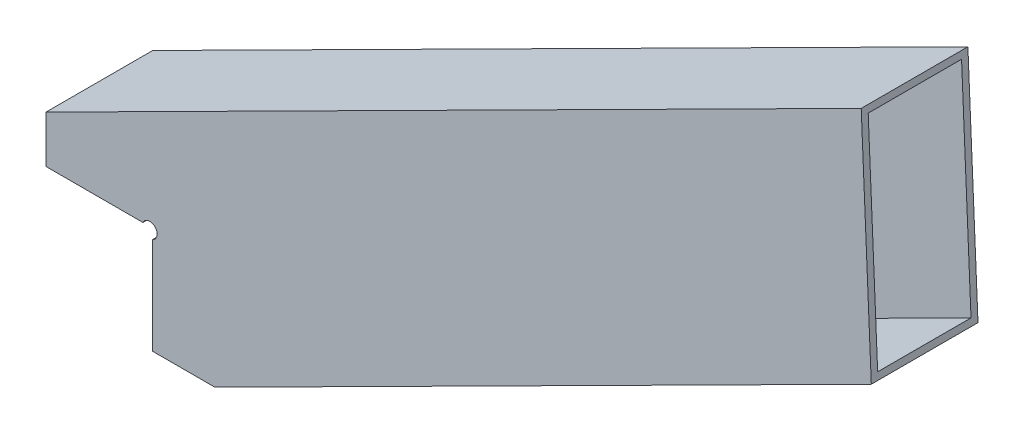
ISO-10303-21;
HEADER;
FILE_DESCRIPTION(('STEP AP214'),'2;1');
FILE_NAME('part.step','',(''),(''),'','','');
FILE_SCHEMA(('AUTOMOTIVE_DESIGN { 1 0 10303 214 1 1 1 1 }'));
ENDSEC;
DATA;
#1=APPLICATION_CONTEXT('core data for automotive mechanical design processes');
#2=APPLICATION_PROTOCOL_DEFINITION('international standard','automotive_design',2000,#1);
#3=PRODUCT_CONTEXT('',#1,'mechanical');
#4=PRODUCT('Part','Part','',(#3));
#5=PRODUCT_RELATED_PRODUCT_CATEGORY('part','',(#4));
#6=PRODUCT_DEFINITION_FORMATION('','',#4);
#7=PRODUCT_DEFINITION_CONTEXT('part definition',#1,'design');
#8=PRODUCT_DEFINITION('design','',#6,#7);
#9=PRODUCT_DEFINITION_SHAPE('','',#8);
#10=(LENGTH_UNIT() NAMED_UNIT(*) SI_UNIT(.MILLI.,.METRE.));
#11=(NAMED_UNIT(*) PLANE_ANGLE_UNIT() SI_UNIT($,.RADIAN.));
#12=(NAMED_UNIT(*) SI_UNIT($,.STERADIAN.) SOLID_ANGLE_UNIT());
#13=UNCERTAINTY_MEASURE_WITH_UNIT(LENGTH_MEASURE(1.E-05),#10,'distance_accuracy_value','');
#14=(GEOMETRIC_REPRESENTATION_CONTEXT(3) GLOBAL_UNCERTAINTY_ASSIGNED_CONTEXT((#13)) GLOBAL_UNIT_ASSIGNED_CONTEXT((#10,
#11,#12)) REPRESENTATION_CONTEXT('',''));
#15=CARTESIAN_POINT('',(0.,0.,0.));
#16=DIRECTION('',(0.,0.,1.));
#17=DIRECTION('',(1.,0.,0.));
#18=AXIS2_PLACEMENT_3D('',#15,#16,#17);
#19=CARTESIAN_POINT('',(171.838432799996,137.597905652,25.4));
#20=DIRECTION('',(-0.999070171367097,-0.0431137180549207,0.));
#21=DIRECTION('',(0.0431137180549207,-0.999070171367097,0.));
#22=AXIS2_PLACEMENT_3D('',#19,#20,#21);
#23=PLANE('',#22);
#24=DIRECTION('',(-0.0431137180549207,0.999070171367097,0.));
#25=VECTOR('',#24,1.);
#26=CARTESIAN_POINT('',(171.838432799996,137.597905652,0.));
#27=LINE('',#26,#25);
#28=CARTESIAN_POINT('',(174.241035507582,81.9226169715513,0.));
#29=VERTEX_POINT('',#28);
#30=CARTESIAN_POINT('',(171.838432799996,137.597905652,0.));
#31=VERTEX_POINT('',#30);
#32=EDGE_CURVE('E211',#29,#31,#27,.T.);
#33=ORIENTED_EDGE('',*,*,#32,.T.);
#34=DIRECTION('',(0.,0.,-1.));
#35=VECTOR('',#34,1.);
#36=CARTESIAN_POINT('',(171.838432799996,137.597905652,25.4));
#37=LINE('',#36,#35);
#38=CARTESIAN_POINT('',(171.838432799996,137.597905652,25.4));
#39=VERTEX_POINT('',#38);
#40=EDGE_CURVE('E46',#39,#31,#37,.T.);
#41=ORIENTED_EDGE('',*,*,#40,.F.);
#42=DIRECTION('',(-0.0431137180549207,0.999070171367097,0.));
#43=VECTOR('',#42,1.);
#44=CARTESIAN_POINT('',(171.838432799996,137.597905652,25.4));
#45=LINE('',#44,#43);
#46=CARTESIAN_POINT('',(174.241035507582,81.9226169715513,25.4));
#47=VERTEX_POINT('',#46);
#48=EDGE_CURVE('E183',#47,#39,#45,.T.);
#49=ORIENTED_EDGE('',*,*,#48,.F.);
#50=DIRECTION('',(0.,0.,-1.));
#51=VECTOR('',#50,1.);
#52=CARTESIAN_POINT('',(174.241035507582,81.9226169715513,25.4));
#53=LINE('',#52,#51);
#54=EDGE_CURVE('E184',#47,#29,#53,.T.);
#55=ORIENTED_EDGE('',*,*,#54,.T.);
#56=EDGE_LOOP('',(#33,#41,#49,#55));
#57=FACE_BOUND('',#56,.T.);
#58=DIRECTION('',(-0.0431137180549207,0.999070171367097,0.));
#59=VECTOR('',#58,1.);
#60=CARTESIAN_POINT('',(171.838432799996,137.597905652,1.5875));
#61=LINE('',#60,#59);
#62=CARTESIAN_POINT('',(174.16595417297,83.6624697428153,1.5875));
#63=VERTEX_POINT('',#62);
#64=CARTESIAN_POINT('',(171.913514134608,135.858052880736,1.5875));
#65=VERTEX_POINT('',#64);
#66=EDGE_CURVE('E233',#63,#65,#61,.T.);
#67=ORIENTED_EDGE('',*,*,#66,.F.);
#68=DIRECTION('',(0.,0.,-1.));
#69=VECTOR('',#68,1.);
#70=CARTESIAN_POINT('',(174.16595417297,83.6624697428153,25.4));
#71=LINE('',#70,#69);
#72=CARTESIAN_POINT('',(174.16595417297,83.6624697428153,23.8125));
#73=VERTEX_POINT('',#72);
#74=EDGE_CURVE('E237',#73,#63,#71,.T.);
#75=ORIENTED_EDGE('',*,*,#74,.F.);
#76=DIRECTION('',(-0.0431137180549207,0.999070171367097,0.));
#77=VECTOR('',#76,1.);
#78=CARTESIAN_POINT('',(171.838432799996,137.597905652,23.8125));
#79=LINE('',#78,#77);
#80=CARTESIAN_POINT('',(171.913514134608,135.858052880736,23.8125));
#81=VERTEX_POINT('',#80);
#82=EDGE_CURVE('E242',#73,#81,#79,.T.);
#83=ORIENTED_EDGE('',*,*,#82,.T.);
#84=DIRECTION('',(0.,0.,-1.));
#85=VECTOR('',#84,1.);
#86=CARTESIAN_POINT('',(171.913514134608,135.858052880736,25.4));
#87=LINE('',#86,#85);
#88=EDGE_CURVE('E215',#81,#65,#87,.T.);
#89=ORIENTED_EDGE('',*,*,#88,.T.);
#90=EDGE_LOOP('',(#67,#75,#83,#89));
#91=FACE_BOUND('',#90,.T.);
#92=ADVANCED_FACE('F39',(#57,#91),#23,.F.);
#93=CARTESIAN_POINT('',(-22.225,39.8002772283526,25.4));
#94=DIRECTION('',(1.,0.,0.));
#95=DIRECTION('',(0.,1.,0.));
#96=AXIS2_PLACEMENT_3D('',#93,#94,#95);
#97=PLANE('',#96);
#98=DIRECTION('',(0.,-1.,0.));
#99=VECTOR('',#98,1.);
#100=CARTESIAN_POINT('',(-22.225,39.8002772283526,1.5875));
#101=LINE('',#100,#99);
#102=CARTESIAN_POINT('',(-22.225,38.0225874655544,1.5875));
#103=VERTEX_POINT('',#102);
#104=CARTESIAN_POINT('',(-22.225,28.575,1.5875));
#105=VERTEX_POINT('',#104);
#106=EDGE_CURVE('E266',#103,#105,#101,.T.);
#107=ORIENTED_EDGE('',*,*,#106,.F.);
#108=DIRECTION('',(0.,0.,-1.));
#109=VECTOR('',#108,1.);
#110=CARTESIAN_POINT('',(-22.225,38.0225874655544,25.4));
#111=LINE('',#110,#109);
#112=CARTESIAN_POINT('',(-22.225,38.0225874655544,23.8125));
#113=VERTEX_POINT('',#112);
#114=EDGE_CURVE('E218',#113,#103,#111,.T.);
#115=ORIENTED_EDGE('',*,*,#114,.F.);
#116=DIRECTION('',(0.,-1.,0.));
#117=VECTOR('',#116,1.);
#118=CARTESIAN_POINT('',(-22.225,39.8002772283526,23.8125));
#119=LINE('',#118,#117);
#120=CARTESIAN_POINT('',(-22.225,28.575,23.8125));
#121=VERTEX_POINT('',#120);
#122=EDGE_CURVE('E247',#113,#121,#119,.T.);
#123=ORIENTED_EDGE('',*,*,#122,.T.);
#124=DIRECTION('',(0.,0.,-1.));
#125=VECTOR('',#124,1.);
#126=CARTESIAN_POINT('',(-22.225,28.575,25.4));
#127=LINE('',#126,#125);
#128=CARTESIAN_POINT('',(-22.225,28.575,25.4));
#129=VERTEX_POINT('',#128);
#130=EDGE_CURVE('E195',#129,#121,#127,.T.);
#131=ORIENTED_EDGE('',*,*,#130,.F.);
#132=DIRECTION('',(0.,-1.,0.));
#133=VECTOR('',#132,1.);
#134=CARTESIAN_POINT('',(-22.225,39.8002772283526,25.4));
#135=LINE('',#134,#133);
#136=CARTESIAN_POINT('',(-22.225,39.8002772283526,25.4));
#137=VERTEX_POINT('',#136);
#138=EDGE_CURVE('E229',#137,#129,#135,.T.);
#139=ORIENTED_EDGE('',*,*,#138,.F.);
#140=DIRECTION('',(0.,0.,-1.));
#141=VECTOR('',#140,1.);
#142=CARTESIAN_POINT('',(-22.225,39.8002772283526,25.4));
#143=LINE('',#142,#141);
#144=CARTESIAN_POINT('',(-22.225,39.8002772283526,0.));
#145=VERTEX_POINT('',#144);
#146=EDGE_CURVE('E198',#137,#145,#143,.T.);
#147=ORIENTED_EDGE('',*,*,#146,.T.);
#148=DIRECTION('',(0.,-1.,0.));
#149=VECTOR('',#148,1.);
#150=CARTESIAN_POINT('',(-22.225,39.8002772283526,0.));
#151=LINE('',#150,#149);
#152=CARTESIAN_POINT('',(-22.225,28.575,0.));
#153=VERTEX_POINT('',#152);
#154=EDGE_CURVE('E172',#145,#153,#151,.T.);
#155=ORIENTED_EDGE('',*,*,#154,.T.);
#156=EDGE_CURVE('E170',#105,#153,#127,.T.);
#157=ORIENTED_EDGE('',*,*,#156,.F.);
#158=EDGE_LOOP('',(#107,#115,#123,#131,#139,#147,#155,#157));
#159=FACE_BOUND('',#158,.T.);
#160=ADVANCED_FACE('F293',(#159),#97,.F.);
#161=CARTESIAN_POINT('',(-22.225,28.575,25.4));
#162=DIRECTION('',(0.,1.,0.));
#163=DIRECTION('',(-1.,0.,0.));
#164=AXIS2_PLACEMENT_3D('',#161,#162,#163);
#165=PLANE('',#164);
#166=DIRECTION('',(1.,0.,0.));
#167=VECTOR('',#166,1.);
#168=CARTESIAN_POINT('',(-22.225,28.575,0.));
#169=LINE('',#168,#167);
#170=CARTESIAN_POINT('',(0.84013340852202,28.575,0.));
#171=VERTEX_POINT('',#170);
#172=EDGE_CURVE('E163',#153,#171,#169,.T.);
#173=ORIENTED_EDGE('',*,*,#172,.T.);
#174=DIRECTION('',(0.,0.,1.));
#175=VECTOR('',#174,1.);
#176=CARTESIAN_POINT('',(0.84013340852202,28.575,0.));
#177=LINE('',#176,#175);
#178=CARTESIAN_POINT('',(0.84013340852202,28.575,1.5875));
#179=VERTEX_POINT('',#178);
#180=EDGE_CURVE('E148',#171,#179,#177,.T.);
#181=ORIENTED_EDGE('',*,*,#180,.T.);
#182=DIRECTION('',(1.,0.,0.));
#183=VECTOR('',#182,1.);
#184=CARTESIAN_POINT('',(-22.225,28.575,1.5875));
#185=LINE('',#184,#183);
#186=EDGE_CURVE('E264',#105,#179,#185,.T.);
#187=ORIENTED_EDGE('',*,*,#186,.F.);
#188=ORIENTED_EDGE('',*,*,#156,.T.);
#189=EDGE_LOOP('',(#173,#181,#187,#188));
#190=FACE_BOUND('',#189,.T.);
#191=ADVANCED_FACE('F168',(#190),#165,.F.);
#192=CARTESIAN_POINT('',(3.175,3.17499999999999,25.4));
#193=DIRECTION('',(1.,0.,0.));
#194=DIRECTION('',(0.,0.,-1.));
#195=AXIS2_PLACEMENT_3D('',#192,#193,#194);
#196=PLANE('',#195);
#197=DIRECTION('',(0.,-1.,0.));
#198=VECTOR('',#197,1.);
#199=CARTESIAN_POINT('',(3.175,3.17499999999999,1.5875));
#200=LINE('',#199,#198);
#201=CARTESIAN_POINT('',(3.175,26.240133408522,1.5875));
#202=VERTEX_POINT('',#201);
#203=CARTESIAN_POINT('',(3.175,3.17499999999999,1.5875));
#204=VERTEX_POINT('',#203);
#205=EDGE_CURVE('E262',#202,#204,#200,.T.);
#206=ORIENTED_EDGE('',*,*,#205,.F.);
#207=DIRECTION('',(0.,0.,1.));
#208=VECTOR('',#207,1.);
#209=CARTESIAN_POINT('',(3.175,26.240133408522,0.));
#210=LINE('',#209,#208);
#211=CARTESIAN_POINT('',(3.175,26.240133408522,0.));
#212=VERTEX_POINT('',#211);
#213=EDGE_CURVE('E60',#202,#212,#210,.F.);
#214=ORIENTED_EDGE('',*,*,#213,.T.);
#215=DIRECTION('',(0.,-1.,0.));
#216=VECTOR('',#215,1.);
#217=CARTESIAN_POINT('',(3.175,3.17499999999999,0.));
#218=LINE('',#217,#216);
#219=CARTESIAN_POINT('',(3.175,3.17499999999999,0.));
#220=VERTEX_POINT('',#219);
#221=EDGE_CURVE('E165',#212,#220,#218,.T.);
#222=ORIENTED_EDGE('',*,*,#221,.T.);
#223=DIRECTION('',(0.,0.,-1.));
#224=VECTOR('',#223,1.);
#225=CARTESIAN_POINT('',(3.175,3.17499999999999,25.4));
#226=LINE('',#225,#224);
#227=EDGE_CURVE('E191',#204,#220,#226,.T.);
#228=ORIENTED_EDGE('',*,*,#227,.F.);
#229=EDGE_LOOP('',(#206,#214,#222,#228));
#230=FACE_BOUND('',#229,.T.);
#231=ADVANCED_FACE('F321',(#230),#196,.F.);
#232=CARTESIAN_POINT('',(3.175,3.17499999999999,25.4));
#233=DIRECTION('',(0.,1.,0.));
#234=DIRECTION('',(-1.,0.,0.));
#235=AXIS2_PLACEMENT_3D('',#232,#233,#234);
#236=PLANE('',#235);
#237=DIRECTION('',(1.,0.,0.));
#238=VECTOR('',#237,1.);
#239=CARTESIAN_POINT('',(3.175,3.17499999999999,1.5875));
#240=LINE('',#239,#238);
#241=CARTESIAN_POINT('',(14.451706215811,3.175,1.5875));
#242=VERTEX_POINT('',#241);
#243=EDGE_CURVE('E260',#204,#242,#240,.T.);
#244=ORIENTED_EDGE('',*,*,#243,.F.);
#245=ORIENTED_EDGE('',*,*,#227,.T.);
#246=DIRECTION('',(1.,0.,0.));
#247=VECTOR('',#246,1.);
#248=CARTESIAN_POINT('',(3.175,3.17499999999999,0.));
#249=LINE('',#248,#247);
#250=CARTESIAN_POINT('',(17.9792414268653,3.175,0.));
#251=VERTEX_POINT('',#250);
#252=EDGE_CURVE('E174',#220,#251,#249,.T.);
#253=ORIENTED_EDGE('',*,*,#252,.T.);
#254=DIRECTION('',(0.,0.,-1.));
#255=VECTOR('',#254,1.);
#256=CARTESIAN_POINT('',(17.9792414268653,3.175,25.4));
#257=LINE('',#256,#255);
#258=CARTESIAN_POINT('',(17.9792414268653,3.175,25.4));
#259=VERTEX_POINT('',#258);
#260=EDGE_CURVE('E187',#259,#251,#257,.T.);
#261=ORIENTED_EDGE('',*,*,#260,.F.);
#262=DIRECTION('',(1.,0.,0.));
#263=VECTOR('',#262,1.);
#264=CARTESIAN_POINT('',(3.175,3.17499999999999,25.4));
#265=LINE('',#264,#263);
#266=CARTESIAN_POINT('',(3.175,3.17499999999999,25.4));
#267=VERTEX_POINT('',#266);
#268=EDGE_CURVE('E222',#267,#259,#265,.T.);
#269=ORIENTED_EDGE('',*,*,#268,.F.);
#270=CARTESIAN_POINT('',(3.175,3.17499999999999,23.8125));
#271=VERTEX_POINT('',#270);
#272=EDGE_CURVE('E192',#267,#271,#226,.T.);
#273=ORIENTED_EDGE('',*,*,#272,.T.);
#274=DIRECTION('',(1.,0.,0.));
#275=VECTOR('',#274,1.);
#276=CARTESIAN_POINT('',(3.175,3.17499999999999,23.8125));
#277=LINE('',#276,#275);
#278=CARTESIAN_POINT('',(14.451706215811,3.175,23.8125));
#279=VERTEX_POINT('',#278);
#280=EDGE_CURVE('E255',#271,#279,#277,.T.);
#281=ORIENTED_EDGE('',*,*,#280,.T.);
#282=DIRECTION('',(0.,0.,-1.));
#283=VECTOR('',#282,1.);
#284=CARTESIAN_POINT('',(14.451706215811,3.175,25.4));
#285=LINE('',#284,#283);
#286=EDGE_CURVE('E240',#279,#242,#285,.T.);
#287=ORIENTED_EDGE('',*,*,#286,.T.);
#288=EDGE_LOOP('',(#244,#245,#253,#261,#269,#273,#281,#287));
#289=FACE_BOUND('',#288,.T.);
#290=ADVANCED_FACE('F309',(#289),#236,.F.);
#291=CARTESIAN_POINT('',(171.838432799996,137.597905652,25.4));
#292=DIRECTION('',(0.450030943709705,-0.893012961666152,0.));
#293=DIRECTION('',(0.893012961666152,0.450030943709705,0.));
#294=AXIS2_PLACEMENT_3D('',#291,#292,#293);
#295=PLANE('',#294);
#296=DIRECTION('',(-0.893012961666152,-0.450030943709705,0.));
#297=VECTOR('',#296,1.);
#298=CARTESIAN_POINT('',(171.838432799996,137.597905652,0.));
#299=LINE('',#298,#297);
#300=EDGE_CURVE('E176',#31,#145,#299,.T.);
#301=ORIENTED_EDGE('',*,*,#300,.T.);
#302=ORIENTED_EDGE('',*,*,#146,.F.);
#303=DIRECTION('',(-0.893012961666152,-0.450030943709705,0.));
#304=VECTOR('',#303,1.);
#305=CARTESIAN_POINT('',(171.838432799996,137.597905652,25.4));
#306=LINE('',#305,#304);
#307=EDGE_CURVE('E206',#39,#137,#306,.T.);
#308=ORIENTED_EDGE('',*,*,#307,.F.);
#309=ORIENTED_EDGE('',*,*,#40,.T.);
#310=EDGE_LOOP('',(#301,#302,#308,#309));
#311=FACE_BOUND('',#310,.T.);
#312=ADVANCED_FACE('F204',(#311),#295,.F.);
#313=DIRECTION('',(1.,0.,0.));
#314=VECTOR('',#313,1.);
#315=CARTESIAN_POINT('',(-22.225,28.575,23.8125));
#316=LINE('',#315,#314);
#317=CARTESIAN_POINT('',(0.84013340852202,28.575,23.8125));
#318=VERTEX_POINT('',#317);
#319=EDGE_CURVE('E250',#121,#318,#316,.T.);
#320=ORIENTED_EDGE('',*,*,#319,.T.);
#321=DIRECTION('',(0.,0.,1.));
#322=VECTOR('',#321,1.);
#323=CARTESIAN_POINT('',(0.84013340852202,28.575,0.));
#324=LINE('',#323,#322);
#325=CARTESIAN_POINT('',(0.84013340852202,28.575,25.4));
#326=VERTEX_POINT('',#325);
#327=EDGE_CURVE('E53',#318,#326,#324,.T.);
#328=ORIENTED_EDGE('',*,*,#327,.T.);
#329=DIRECTION('',(1.,0.,0.));
#330=VECTOR('',#329,1.);
#331=CARTESIAN_POINT('',(-22.225,28.575,25.4));
#332=LINE('',#331,#330);
#333=EDGE_CURVE('E226',#129,#326,#332,.T.);
#334=ORIENTED_EDGE('',*,*,#333,.F.);
#335=ORIENTED_EDGE('',*,*,#130,.T.);
#336=EDGE_LOOP('',(#320,#328,#334,#335));
#337=FACE_BOUND('',#336,.T.);
#338=ADVANCED_FACE('F287',(#337),#165,.F.);
#339=DIRECTION('',(0.,-1.,0.));
#340=VECTOR('',#339,1.);
#341=CARTESIAN_POINT('',(3.175,3.17499999999999,25.4));
#342=LINE('',#341,#340);
#343=CARTESIAN_POINT('',(3.175,26.240133408522,25.4));
#344=VERTEX_POINT('',#343);
#345=EDGE_CURVE('E224',#344,#267,#342,.T.);
#346=ORIENTED_EDGE('',*,*,#345,.F.);
#347=DIRECTION('',(0.,0.,1.));
#348=VECTOR('',#347,1.);
#349=CARTESIAN_POINT('',(3.175,26.240133408522,0.));
#350=LINE('',#349,#348);
#351=CARTESIAN_POINT('',(3.175,26.240133408522,23.8125));
#352=VERTEX_POINT('',#351);
#353=EDGE_CURVE('E276',#344,#352,#350,.F.);
#354=ORIENTED_EDGE('',*,*,#353,.T.);
#355=DIRECTION('',(0.,-1.,0.));
#356=VECTOR('',#355,1.);
#357=CARTESIAN_POINT('',(3.175,3.17499999999999,23.8125));
#358=LINE('',#357,#356);
#359=EDGE_CURVE('E253',#352,#271,#358,.T.);
#360=ORIENTED_EDGE('',*,*,#359,.T.);
#361=ORIENTED_EDGE('',*,*,#272,.F.);
#362=EDGE_LOOP('',(#346,#354,#360,#361));
#363=FACE_BOUND('',#362,.T.);
#364=ADVANCED_FACE('F302',(#363),#196,.F.);
#365=CARTESIAN_POINT('',(174.241035507582,81.9226169715513,25.4));
#366=DIRECTION('',(-0.450030943709705,0.893012961666152,0.));
#367=DIRECTION('',(-0.893012961666152,-0.450030943709705,0.));
#368=AXIS2_PLACEMENT_3D('',#365,#366,#367);
#369=PLANE('',#368);
#370=DIRECTION('',(0.893012961666152,0.450030943709705,0.));
#371=VECTOR('',#370,1.);
#372=CARTESIAN_POINT('',(174.241035507582,81.9226169715513,0.));
#373=LINE('',#372,#371);
#374=EDGE_CURVE('E181',#251,#29,#373,.T.);
#375=ORIENTED_EDGE('',*,*,#374,.T.);
#376=ORIENTED_EDGE('',*,*,#54,.F.);
#377=DIRECTION('',(0.893012961666152,0.450030943709705,0.));
#378=VECTOR('',#377,1.);
#379=CARTESIAN_POINT('',(174.241035507582,81.9226169715513,25.4));
#380=LINE('',#379,#378);
#381=EDGE_CURVE('E188',#259,#47,#380,.T.);
#382=ORIENTED_EDGE('',*,*,#381,.F.);
#383=ORIENTED_EDGE('',*,*,#260,.T.);
#384=EDGE_LOOP('',(#375,#376,#382,#383));
#385=FACE_BOUND('',#384,.T.);
#386=ADVANCED_FACE('F312',(#385),#369,.F.);
#387=CARTESIAN_POINT('',(0.,0.,25.4));
#388=DIRECTION('',(0.,0.,1.));
#389=DIRECTION('',(1.,0.,0.));
#390=AXIS2_PLACEMENT_3D('',#387,#388,#389);
#391=PLANE('',#390);
#392=CARTESIAN_POINT('',(2.4613059609045,27.8613059609045,25.4));
#393=DIRECTION('',(0.,0.,1.));
#394=DIRECTION('',(1.,0.,0.));
#395=AXIS2_PLACEMENT_3D('',#392,#393,#394);
#396=CIRCLE('',#395,1.77131578947369);
#397=EDGE_CURVE('E166',#344,#326,#396,.T.);
#398=ORIENTED_EDGE('',*,*,#397,.F.);
#399=ORIENTED_EDGE('',*,*,#345,.T.);
#400=ORIENTED_EDGE('',*,*,#268,.T.);
#401=ORIENTED_EDGE('',*,*,#381,.T.);
#402=ORIENTED_EDGE('',*,*,#48,.T.);
#403=ORIENTED_EDGE('',*,*,#307,.T.);
#404=ORIENTED_EDGE('',*,*,#138,.T.);
#405=ORIENTED_EDGE('',*,*,#333,.T.);
#406=EDGE_LOOP('',(#398,#399,#400,#401,#402,#403,#404,#405));
#407=FACE_BOUND('',#406,.T.);
#408=ADVANCED_FACE('F288',(#407),#391,.T.);
#409=CARTESIAN_POINT('',(0.,0.,0.));
#410=DIRECTION('',(0.,0.,1.));
#411=DIRECTION('',(1.,0.,0.));
#412=AXIS2_PLACEMENT_3D('',#409,#410,#411);
#413=PLANE('',#412);
#414=ORIENTED_EDGE('',*,*,#221,.F.);
#415=CARTESIAN_POINT('',(2.4613059609045,27.8613059609045,0.));
#416=DIRECTION('',(0.,0.,1.));
#417=DIRECTION('',(1.,0.,0.));
#418=AXIS2_PLACEMENT_3D('',#415,#416,#417);
#419=CIRCLE('',#418,1.77131578947369);
#420=EDGE_CURVE('E151',#212,#171,#419,.T.);
#421=ORIENTED_EDGE('',*,*,#420,.T.);
#422=ORIENTED_EDGE('',*,*,#172,.F.);
#423=ORIENTED_EDGE('',*,*,#154,.F.);
#424=ORIENTED_EDGE('',*,*,#300,.F.);
#425=ORIENTED_EDGE('',*,*,#32,.F.);
#426=ORIENTED_EDGE('',*,*,#374,.F.);
#427=ORIENTED_EDGE('',*,*,#252,.F.);
#428=EDGE_LOOP('',(#414,#421,#422,#423,#424,#425,#426,#427));
#429=FACE_BOUND('',#428,.T.);
#430=ADVANCED_FACE('F161',(#429),#413,.F.);
#431=CARTESIAN_POINT('',(172.552856923135,136.180247575355,25.4));
#432=DIRECTION('',(0.450030943709705,-0.893012961666152,0.));
#433=DIRECTION('',(0.893012961666152,0.450030943709705,0.));
#434=AXIS2_PLACEMENT_3D('',#431,#432,#433);
#435=PLANE('',#434);
#436=DIRECTION('',(-0.893012961666152,-0.450030943709705,0.));
#437=VECTOR('',#436,1.);
#438=CARTESIAN_POINT('',(172.552856923135,136.180247575355,1.5875));
#439=LINE('',#438,#437);
#440=EDGE_CURVE('E236',#65,#103,#439,.T.);
#441=ORIENTED_EDGE('',*,*,#440,.F.);
#442=ORIENTED_EDGE('',*,*,#88,.F.);
#443=DIRECTION('',(-0.893012961666152,-0.450030943709705,0.));
#444=VECTOR('',#443,1.);
#445=CARTESIAN_POINT('',(172.552856923135,136.180247575355,23.8125));
#446=LINE('',#445,#444);
#447=EDGE_CURVE('E244',#81,#113,#446,.T.);
#448=ORIENTED_EDGE('',*,*,#447,.T.);
#449=ORIENTED_EDGE('',*,*,#114,.T.);
#450=EDGE_LOOP('',(#441,#442,#448,#449));
#451=FACE_BOUND('',#450,.T.);
#452=ADVANCED_FACE('F355',(#451),#435,.T.);
#453=CARTESIAN_POINT('',(173.526611384443,83.3402750481963,25.4));
#454=DIRECTION('',(-0.450030943709705,0.893012961666152,0.));
#455=DIRECTION('',(-0.893012961666152,-0.450030943709705,0.));
#456=AXIS2_PLACEMENT_3D('',#453,#454,#455);
#457=PLANE('',#456);
#458=DIRECTION('',(0.893012961666152,0.450030943709705,0.));
#459=VECTOR('',#458,1.);
#460=CARTESIAN_POINT('',(173.526611384443,83.3402750481963,1.5875));
#461=LINE('',#460,#459);
#462=EDGE_CURVE('E245',#242,#63,#461,.T.);
#463=ORIENTED_EDGE('',*,*,#462,.F.);
#464=ORIENTED_EDGE('',*,*,#286,.F.);
#465=DIRECTION('',(0.893012961666152,0.450030943709705,0.));
#466=VECTOR('',#465,1.);
#467=CARTESIAN_POINT('',(173.526611384443,83.3402750481963,23.8125));
#468=LINE('',#467,#466);
#469=EDGE_CURVE('E241',#279,#73,#468,.T.);
#470=ORIENTED_EDGE('',*,*,#469,.T.);
#471=ORIENTED_EDGE('',*,*,#74,.T.);
#472=EDGE_LOOP('',(#463,#464,#470,#471));
#473=FACE_BOUND('',#472,.T.);
#474=ADVANCED_FACE('F351',(#473),#457,.T.);
#475=CARTESIAN_POINT('',(0.,0.,23.8125));
#476=DIRECTION('',(0.,0.,1.));
#477=DIRECTION('',(1.,0.,0.));
#478=AXIS2_PLACEMENT_3D('',#475,#476,#477);
#479=PLANE('',#478);
#480=ORIENTED_EDGE('',*,*,#359,.F.);
#481=CARTESIAN_POINT('',(2.4613059609045,27.8613059609045,23.8125));
#482=DIRECTION('',(0.,0.,1.));
#483=DIRECTION('',(1.,0.,0.));
#484=AXIS2_PLACEMENT_3D('',#481,#482,#483);
#485=CIRCLE('',#484,1.77131578947369);
#486=EDGE_CURVE('E156',#352,#318,#485,.T.);
#487=ORIENTED_EDGE('',*,*,#486,.T.);
#488=ORIENTED_EDGE('',*,*,#319,.F.);
#489=ORIENTED_EDGE('',*,*,#122,.F.);
#490=ORIENTED_EDGE('',*,*,#447,.F.);
#491=ORIENTED_EDGE('',*,*,#82,.F.);
#492=ORIENTED_EDGE('',*,*,#469,.F.);
#493=ORIENTED_EDGE('',*,*,#280,.F.);
#494=EDGE_LOOP('',(#480,#487,#488,#489,#490,#491,#492,#493));
#495=FACE_BOUND('',#494,.T.);
#496=ADVANCED_FACE('F298',(#495),#479,.F.);
#497=CARTESIAN_POINT('',(0.,0.,1.5875));
#498=DIRECTION('',(0.,0.,1.));
#499=DIRECTION('',(1.,0.,0.));
#500=AXIS2_PLACEMENT_3D('',#497,#498,#499);
#501=PLANE('',#500);
#502=CARTESIAN_POINT('',(2.4613059609045,27.8613059609045,1.5875));
#503=DIRECTION('',(0.,0.,1.));
#504=DIRECTION('',(1.,0.,0.));
#505=AXIS2_PLACEMENT_3D('',#502,#503,#504);
#506=CIRCLE('',#505,1.77131578947369);
#507=EDGE_CURVE('E11',#202,#179,#506,.T.);
#508=ORIENTED_EDGE('',*,*,#507,.F.);
#509=ORIENTED_EDGE('',*,*,#205,.T.);
#510=ORIENTED_EDGE('',*,*,#243,.T.);
#511=ORIENTED_EDGE('',*,*,#462,.T.);
#512=ORIENTED_EDGE('',*,*,#66,.T.);
#513=ORIENTED_EDGE('',*,*,#440,.T.);
#514=ORIENTED_EDGE('',*,*,#106,.T.);
#515=ORIENTED_EDGE('',*,*,#186,.T.);
#516=EDGE_LOOP('',(#508,#509,#510,#511,#512,#513,#514,#515));
#517=FACE_BOUND('',#516,.T.);
#518=ADVANCED_FACE('F347',(#517),#501,.T.);
#519=CARTESIAN_POINT('',(2.4613059609045,27.8613059609045,0.));
#520=DIRECTION('',(0.,0.,1.));
#521=DIRECTION('',(1.,0.,0.));
#522=AXIS2_PLACEMENT_3D('',#519,#520,#521);
#523=CYLINDRICAL_SURFACE('',#522,1.77131578947369);
#524=ORIENTED_EDGE('',*,*,#420,.F.);
#525=ORIENTED_EDGE('',*,*,#213,.F.);
#526=ORIENTED_EDGE('',*,*,#507,.T.);
#527=ORIENTED_EDGE('',*,*,#180,.F.);
#528=EDGE_LOOP('',(#524,#525,#526,#527));
#529=FACE_BOUND('',#528,.T.);
#530=ADVANCED_FACE('F150',(#529),#523,.F.);
#531=ORIENTED_EDGE('',*,*,#486,.F.);
#532=ORIENTED_EDGE('',*,*,#353,.F.);
#533=ORIENTED_EDGE('',*,*,#397,.T.);
#534=ORIENTED_EDGE('',*,*,#327,.F.);
#535=EDGE_LOOP('',(#531,#532,#533,#534));
#536=FACE_BOUND('',#535,.T.);
#537=ADVANCED_FACE('F282',(#536),#523,.F.);
#538=CLOSED_SHELL('',(#92,#160,#191,#231,#290,#312,#338,#364,#386,#408,#430,#452,#474,#496,#518,
#530,#537));
#539=MANIFOLD_SOLID_BREP('B2',#538);
#540=ADVANCED_BREP_SHAPE_REPRESENTATION('',(#18,#539),#14);
#541=SHAPE_DEFINITION_REPRESENTATION(#9,#540);
ENDSEC;
END-ISO-10303-21;
